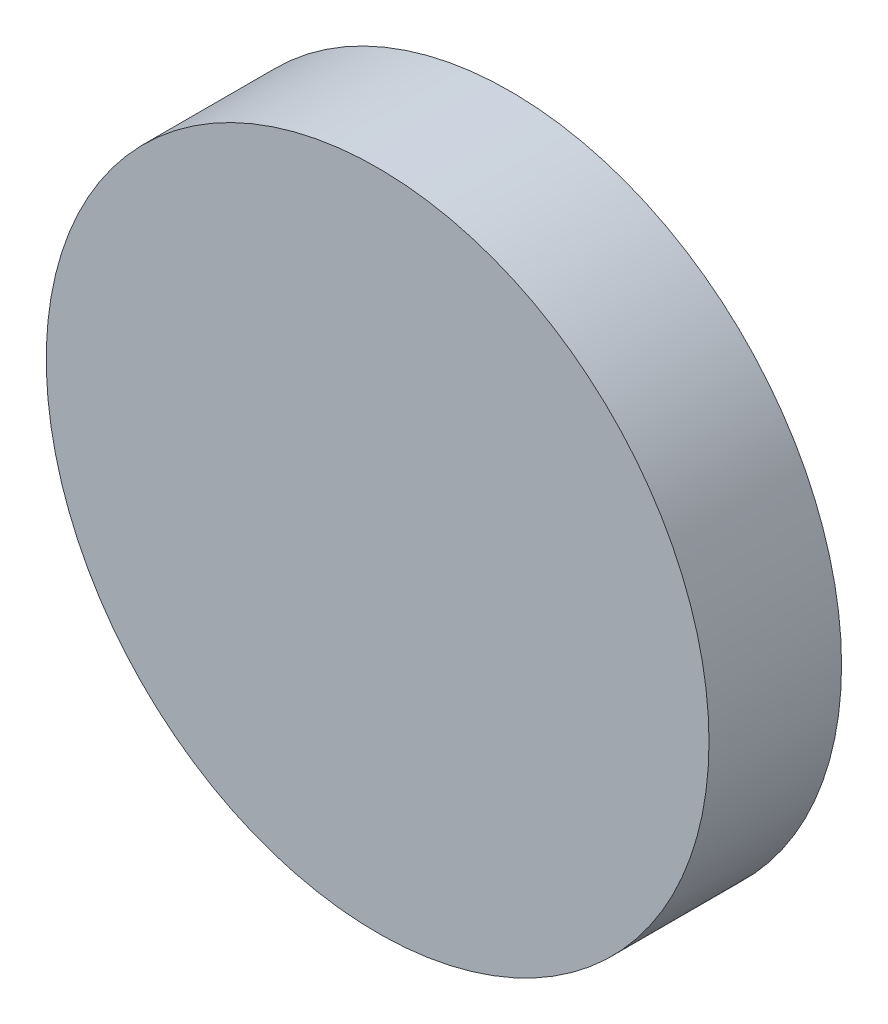
ISO-10303-21;
HEADER;
FILE_DESCRIPTION(('STEP AP214'),'2;1');
FILE_NAME('part.step','',(''),(''),'','','');
FILE_SCHEMA(('AUTOMOTIVE_DESIGN { 1 0 10303 214 1 1 1 1 }'));
ENDSEC;
DATA;
#1=APPLICATION_CONTEXT('core data for automotive mechanical design processes');
#2=APPLICATION_PROTOCOL_DEFINITION('international standard','automotive_design',2000,#1);
#3=PRODUCT_CONTEXT('',#1,'mechanical');
#4=PRODUCT('Part','Part','',(#3));
#5=PRODUCT_RELATED_PRODUCT_CATEGORY('part','',(#4));
#6=PRODUCT_DEFINITION_FORMATION('','',#4);
#7=PRODUCT_DEFINITION_CONTEXT('part definition',#1,'design');
#8=PRODUCT_DEFINITION('design','',#6,#7);
#9=PRODUCT_DEFINITION_SHAPE('','',#8);
#10=(LENGTH_UNIT() NAMED_UNIT(*) SI_UNIT(.MILLI.,.METRE.));
#11=(NAMED_UNIT(*) PLANE_ANGLE_UNIT() SI_UNIT($,.RADIAN.));
#12=(NAMED_UNIT(*) SI_UNIT($,.STERADIAN.) SOLID_ANGLE_UNIT());
#13=UNCERTAINTY_MEASURE_WITH_UNIT(LENGTH_MEASURE(1.E-05),#10,'distance_accuracy_value','');
#14=(GEOMETRIC_REPRESENTATION_CONTEXT(3) GLOBAL_UNCERTAINTY_ASSIGNED_CONTEXT((#13)) GLOBAL_UNIT_ASSIGNED_CONTEXT((#10,
#11,#12)) REPRESENTATION_CONTEXT('',''));
#15=CARTESIAN_POINT('',(0.,0.,0.));
#16=DIRECTION('',(0.,0.,1.));
#17=DIRECTION('',(1.,0.,0.));
#18=AXIS2_PLACEMENT_3D('',#15,#16,#17);
#19=CARTESIAN_POINT('',(1090.,1805.,-240.));
#20=DIRECTION('',(0.,0.,1.));
#21=DIRECTION('',(1.,0.,0.));
#22=AXIS2_PLACEMENT_3D('',#19,#20,#21);
#23=CYLINDRICAL_SURFACE('',#22,100.);
#24=CARTESIAN_POINT('',(1090.,1805.,-240.));
#25=DIRECTION('',(0.,0.,1.));
#26=DIRECTION('',(1.,0.,0.));
#27=AXIS2_PLACEMENT_3D('',#24,#25,#26);
#28=CIRCLE('',#27,100.);
#29=CARTESIAN_POINT('',(1190.,1805.,-240.));
#30=VERTEX_POINT('',#29);
#31=EDGE_CURVE('E10',#30,#30,#28,.T.);
#32=ORIENTED_EDGE('',*,*,#31,.T.);
#33=EDGE_LOOP('',(#32));
#34=FACE_BOUND('',#33,.T.);
#35=CARTESIAN_POINT('',(1090.,1805.,-200.));
#36=DIRECTION('',(0.,0.,1.));
#37=DIRECTION('',(1.,0.,0.));
#38=AXIS2_PLACEMENT_3D('',#35,#36,#37);
#39=CIRCLE('',#38,100.);
#40=CARTESIAN_POINT('',(1190.,1805.,-200.));
#41=VERTEX_POINT('',#40);
#42=EDGE_CURVE('E40',#41,#41,#39,.T.);
#43=ORIENTED_EDGE('',*,*,#42,.F.);
#44=EDGE_LOOP('',(#43));
#45=FACE_BOUND('',#44,.T.);
#46=ADVANCED_FACE('F37',(#34,#45),#23,.T.);
#47=CARTESIAN_POINT('',(1090.,1805.,-240.));
#48=DIRECTION('',(0.,0.,1.));
#49=DIRECTION('',(1.,0.,0.));
#50=AXIS2_PLACEMENT_3D('',#47,#48,#49);
#51=PLANE('',#50);
#52=ORIENTED_EDGE('',*,*,#31,.F.);
#53=EDGE_LOOP('',(#52));
#54=FACE_BOUND('',#53,.T.);
#55=ADVANCED_FACE('F52',(#54),#51,.F.);
#56=CARTESIAN_POINT('',(1090.,1805.,-200.));
#57=DIRECTION('',(0.,0.,1.));
#58=DIRECTION('',(1.,0.,0.));
#59=AXIS2_PLACEMENT_3D('',#56,#57,#58);
#60=PLANE('',#59);
#61=ORIENTED_EDGE('',*,*,#42,.T.);
#62=EDGE_LOOP('',(#61));
#63=FACE_BOUND('',#62,.T.);
#64=ADVANCED_FACE('F49',(#63),#60,.T.);
#65=CLOSED_SHELL('',(#46,#55,#64));
#66=MANIFOLD_SOLID_BREP('B2',#65);
#67=ADVANCED_BREP_SHAPE_REPRESENTATION('',(#18,#66),#14);
#68=SHAPE_DEFINITION_REPRESENTATION(#9,#67);
ENDSEC;
END-ISO-10303-21;
